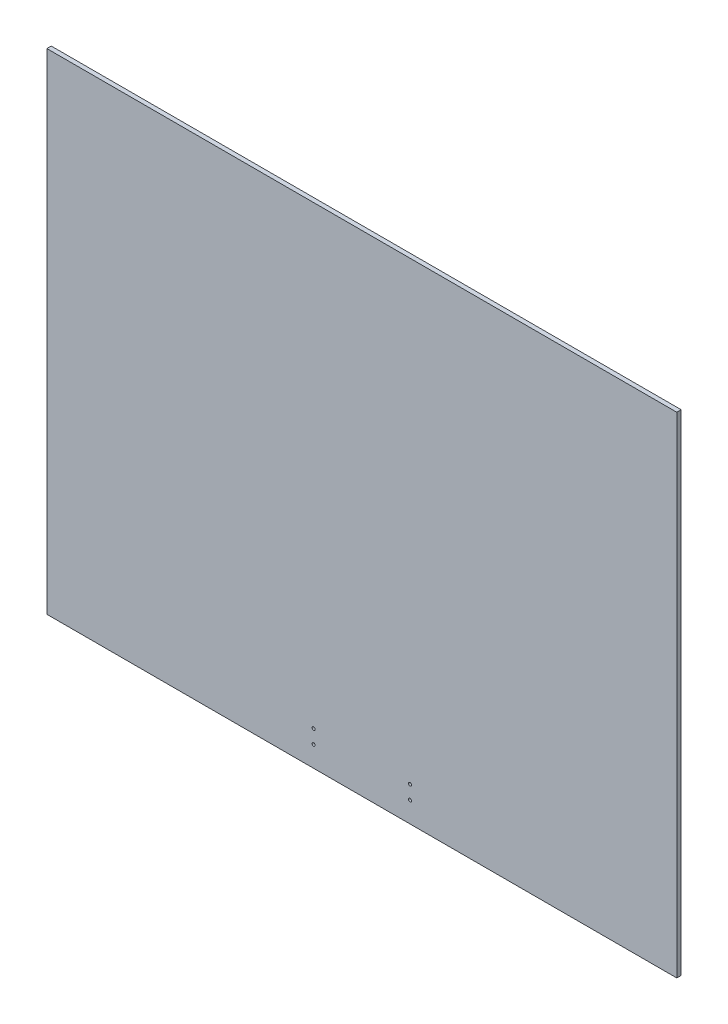
ISO-10303-21;
HEADER;
FILE_DESCRIPTION(('STEP AP214'),'2;1');
FILE_NAME('part.step','',(''),(''),'','','');
FILE_SCHEMA(('AUTOMOTIVE_DESIGN { 1 0 10303 214 1 1 1 1 }'));
ENDSEC;
DATA;
#1=APPLICATION_CONTEXT('core data for automotive mechanical design processes');
#2=APPLICATION_PROTOCOL_DEFINITION('international standard','automotive_design',2000,#1);
#3=PRODUCT_CONTEXT('',#1,'mechanical');
#4=PRODUCT('Part','Part','',(#3));
#5=PRODUCT_RELATED_PRODUCT_CATEGORY('part','',(#4));
#6=PRODUCT_DEFINITION_FORMATION('','',#4);
#7=PRODUCT_DEFINITION_CONTEXT('part definition',#1,'design');
#8=PRODUCT_DEFINITION('design','',#6,#7);
#9=PRODUCT_DEFINITION_SHAPE('','',#8);
#10=(LENGTH_UNIT() NAMED_UNIT(*) SI_UNIT(.MILLI.,.METRE.));
#11=(NAMED_UNIT(*) PLANE_ANGLE_UNIT() SI_UNIT($,.RADIAN.));
#12=(NAMED_UNIT(*) SI_UNIT($,.STERADIAN.) SOLID_ANGLE_UNIT());
#13=UNCERTAINTY_MEASURE_WITH_UNIT(LENGTH_MEASURE(1.E-05),#10,'distance_accuracy_value','');
#14=(GEOMETRIC_REPRESENTATION_CONTEXT(3) GLOBAL_UNCERTAINTY_ASSIGNED_CONTEXT((#13)) GLOBAL_UNIT_ASSIGNED_CONTEXT((#10,
#11,#12)) REPRESENTATION_CONTEXT('',''));
#15=CARTESIAN_POINT('',(0.,0.,0.));
#16=DIRECTION('',(0.,0.,1.));
#17=DIRECTION('',(1.,0.,0.));
#18=AXIS2_PLACEMENT_3D('',#15,#16,#17);
#19=CARTESIAN_POINT('',(457.2,-355.6,6.35));
#20=DIRECTION('',(-1.,0.,0.));
#21=DIRECTION('',(0.,0.,1.));
#22=AXIS2_PLACEMENT_3D('',#19,#20,#21);
#23=PLANE('',#22);
#24=DIRECTION('',(0.,1.,0.));
#25=VECTOR('',#24,1.);
#26=CARTESIAN_POINT('',(457.2,-355.6,0.));
#27=LINE('',#26,#25);
#28=CARTESIAN_POINT('',(457.2,-355.6,0.));
#29=VERTEX_POINT('',#28);
#30=CARTESIAN_POINT('',(457.2,355.6,0.));
#31=VERTEX_POINT('',#30);
#32=EDGE_CURVE('E117',#29,#31,#27,.T.);
#33=ORIENTED_EDGE('',*,*,#32,.T.);
#34=DIRECTION('',(0.,0.,-1.));
#35=VECTOR('',#34,1.);
#36=CARTESIAN_POINT('',(457.2,355.6,6.35));
#37=LINE('',#36,#35);
#38=CARTESIAN_POINT('',(457.2,355.6,6.35));
#39=VERTEX_POINT('',#38);
#40=EDGE_CURVE('E11',#39,#31,#37,.T.);
#41=ORIENTED_EDGE('',*,*,#40,.F.);
#42=DIRECTION('',(0.,1.,0.));
#43=VECTOR('',#42,1.);
#44=CARTESIAN_POINT('',(457.2,-355.6,6.35));
#45=LINE('',#44,#43);
#46=CARTESIAN_POINT('',(457.2,-355.6,6.35));
#47=VERTEX_POINT('',#46);
#48=EDGE_CURVE('E100',#47,#39,#45,.T.);
#49=ORIENTED_EDGE('',*,*,#48,.F.);
#50=DIRECTION('',(0.,0.,-1.));
#51=VECTOR('',#50,1.);
#52=CARTESIAN_POINT('',(457.2,-355.6,6.35));
#53=LINE('',#52,#51);
#54=EDGE_CURVE('E113',#47,#29,#53,.T.);
#55=ORIENTED_EDGE('',*,*,#54,.T.);
#56=EDGE_LOOP('',(#33,#41,#49,#55));
#57=FACE_BOUND('',#56,.T.);
#58=ADVANCED_FACE('F48',(#57),#23,.F.);
#59=CARTESIAN_POINT('',(-457.2,355.6,6.35));
#60=DIRECTION('',(0.,-1.,0.));
#61=DIRECTION('',(0.,0.,-1.));
#62=AXIS2_PLACEMENT_3D('',#59,#60,#61);
#63=PLANE('',#62);
#64=DIRECTION('',(-1.,0.,0.));
#65=VECTOR('',#64,1.);
#66=CARTESIAN_POINT('',(-457.2,355.6,0.));
#67=LINE('',#66,#65);
#68=CARTESIAN_POINT('',(-457.2,355.6,0.));
#69=VERTEX_POINT('',#68);
#70=EDGE_CURVE('E105',#31,#69,#67,.T.);
#71=ORIENTED_EDGE('',*,*,#70,.T.);
#72=DIRECTION('',(0.,0.,-1.));
#73=VECTOR('',#72,1.);
#74=CARTESIAN_POINT('',(-457.2,355.6,6.35));
#75=LINE('',#74,#73);
#76=CARTESIAN_POINT('',(-457.2,355.6,6.35));
#77=VERTEX_POINT('',#76);
#78=EDGE_CURVE('E57',#77,#69,#75,.T.);
#79=ORIENTED_EDGE('',*,*,#78,.F.);
#80=DIRECTION('',(-1.,0.,0.));
#81=VECTOR('',#80,1.);
#82=CARTESIAN_POINT('',(-457.2,355.6,6.35));
#83=LINE('',#82,#81);
#84=EDGE_CURVE('E95',#39,#77,#83,.T.);
#85=ORIENTED_EDGE('',*,*,#84,.F.);
#86=ORIENTED_EDGE('',*,*,#40,.T.);
#87=EDGE_LOOP('',(#71,#79,#85,#86));
#88=FACE_BOUND('',#87,.T.);
#89=ADVANCED_FACE('F104',(#88),#63,.F.);
#90=CARTESIAN_POINT('',(-457.2,-355.6,6.35));
#91=DIRECTION('',(1.,0.,0.));
#92=DIRECTION('',(0.,0.,-1.));
#93=AXIS2_PLACEMENT_3D('',#90,#91,#92);
#94=PLANE('',#93);
#95=DIRECTION('',(0.,-1.,0.));
#96=VECTOR('',#95,1.);
#97=CARTESIAN_POINT('',(-457.2,-355.6,0.));
#98=LINE('',#97,#96);
#99=CARTESIAN_POINT('',(-457.2,-355.6,0.));
#100=VERTEX_POINT('',#99);
#101=EDGE_CURVE('E82',#69,#100,#98,.T.);
#102=ORIENTED_EDGE('',*,*,#101,.T.);
#103=DIRECTION('',(0.,0.,-1.));
#104=VECTOR('',#103,1.);
#105=CARTESIAN_POINT('',(-457.2,-355.6,6.35));
#106=LINE('',#105,#104);
#107=CARTESIAN_POINT('',(-457.2,-355.6,6.35));
#108=VERTEX_POINT('',#107);
#109=EDGE_CURVE('E107',#108,#100,#106,.T.);
#110=ORIENTED_EDGE('',*,*,#109,.F.);
#111=DIRECTION('',(0.,-1.,0.));
#112=VECTOR('',#111,1.);
#113=CARTESIAN_POINT('',(-457.2,-355.6,6.35));
#114=LINE('',#113,#112);
#115=EDGE_CURVE('E98',#77,#108,#114,.T.);
#116=ORIENTED_EDGE('',*,*,#115,.F.);
#117=ORIENTED_EDGE('',*,*,#78,.T.);
#118=EDGE_LOOP('',(#102,#110,#116,#117));
#119=FACE_BOUND('',#118,.T.);
#120=ADVANCED_FACE('F108',(#119),#94,.F.);
#121=CARTESIAN_POINT('',(-457.2,-355.6,6.35));
#122=DIRECTION('',(0.,1.,0.));
#123=DIRECTION('',(0.,0.,1.));
#124=AXIS2_PLACEMENT_3D('',#121,#122,#123);
#125=PLANE('',#124);
#126=DIRECTION('',(1.,0.,0.));
#127=VECTOR('',#126,1.);
#128=CARTESIAN_POINT('',(-457.2,-355.6,0.));
#129=LINE('',#128,#127);
#130=EDGE_CURVE('E88',#100,#29,#129,.T.);
#131=ORIENTED_EDGE('',*,*,#130,.T.);
#132=ORIENTED_EDGE('',*,*,#54,.F.);
#133=DIRECTION('',(1.,0.,0.));
#134=VECTOR('',#133,1.);
#135=CARTESIAN_POINT('',(-457.2,-355.6,6.35));
#136=LINE('',#135,#134);
#137=EDGE_CURVE('E65',#108,#47,#136,.T.);
#138=ORIENTED_EDGE('',*,*,#137,.F.);
#139=ORIENTED_EDGE('',*,*,#109,.T.);
#140=EDGE_LOOP('',(#131,#132,#138,#139));
#141=FACE_BOUND('',#140,.T.);
#142=ADVANCED_FACE('F132',(#141),#125,.F.);
#143=CARTESIAN_POINT('',(0.,0.,6.35));
#144=DIRECTION('',(0.,0.,-1.));
#145=DIRECTION('',(-1.,0.,0.));
#146=AXIS2_PLACEMENT_3D('',#143,#144,#145);
#147=PLANE('',#146);
#148=CARTESIAN_POINT('',(70.,-325.6,6.35));
#149=DIRECTION('',(0.,0.,1.));
#150=DIRECTION('',(1.,0.,0.));
#151=AXIS2_PLACEMENT_3D('',#148,#149,#150);
#152=CIRCLE('',#151,2.20000000000001);
#153=CARTESIAN_POINT('',(72.2,-325.6,6.35));
#154=VERTEX_POINT('',#153);
#155=EDGE_CURVE('E157',#154,#154,#152,.T.);
#156=ORIENTED_EDGE('',*,*,#155,.F.);
#157=EDGE_LOOP('',(#156));
#158=FACE_BOUND('',#157,.T.);
#159=CARTESIAN_POINT('',(-70.,-305.6,6.35));
#160=DIRECTION('',(0.,0.,1.));
#161=DIRECTION('',(1.,0.,0.));
#162=AXIS2_PLACEMENT_3D('',#159,#160,#161);
#163=CIRCLE('',#162,2.19999999999999);
#164=CARTESIAN_POINT('',(-67.8000000000001,-305.6,6.35));
#165=VERTEX_POINT('',#164);
#166=EDGE_CURVE('E148',#165,#165,#163,.T.);
#167=ORIENTED_EDGE('',*,*,#166,.F.);
#168=EDGE_LOOP('',(#167));
#169=FACE_BOUND('',#168,.T.);
#170=CARTESIAN_POINT('',(-70.,-325.6,6.35));
#171=DIRECTION('',(0.,0.,1.));
#172=DIRECTION('',(1.,0.,0.));
#173=AXIS2_PLACEMENT_3D('',#170,#171,#172);
#174=CIRCLE('',#173,2.20000000000001);
#175=CARTESIAN_POINT('',(-67.8,-325.6,6.35));
#176=VERTEX_POINT('',#175);
#177=EDGE_CURVE('E164',#176,#176,#174,.T.);
#178=ORIENTED_EDGE('',*,*,#177,.F.);
#179=EDGE_LOOP('',(#178));
#180=FACE_BOUND('',#179,.T.);
#181=CARTESIAN_POINT('',(69.9999999999998,-305.6,6.35));
#182=DIRECTION('',(0.,0.,1.));
#183=DIRECTION('',(1.,0.,0.));
#184=AXIS2_PLACEMENT_3D('',#181,#182,#183);
#185=CIRCLE('',#184,2.19999999999999);
#186=CARTESIAN_POINT('',(72.1999999999998,-305.6,6.35));
#187=VERTEX_POINT('',#186);
#188=EDGE_CURVE('E140',#187,#187,#185,.T.);
#189=ORIENTED_EDGE('',*,*,#188,.F.);
#190=EDGE_LOOP('',(#189));
#191=FACE_BOUND('',#190,.T.);
#192=ORIENTED_EDGE('',*,*,#48,.T.);
#193=ORIENTED_EDGE('',*,*,#84,.T.);
#194=ORIENTED_EDGE('',*,*,#115,.T.);
#195=ORIENTED_EDGE('',*,*,#137,.T.);
#196=EDGE_LOOP('',(#192,#193,#194,#195));
#197=FACE_BOUND('',#196,.T.);
#198=ADVANCED_FACE('F96',(#158,#169,#180,#191,#197),#147,.F.);
#199=CARTESIAN_POINT('',(0.,0.,0.));
#200=DIRECTION('',(0.,0.,-1.));
#201=DIRECTION('',(-1.,0.,0.));
#202=AXIS2_PLACEMENT_3D('',#199,#200,#201);
#203=PLANE('',#202);
#204=CARTESIAN_POINT('',(70.,-325.6,0.));
#205=DIRECTION('',(0.,0.,1.));
#206=DIRECTION('',(1.,0.,0.));
#207=AXIS2_PLACEMENT_3D('',#204,#205,#206);
#208=CIRCLE('',#207,2.20000000000001);
#209=CARTESIAN_POINT('',(72.2,-325.6,0.));
#210=VERTEX_POINT('',#209);
#211=EDGE_CURVE('E144',#210,#210,#208,.T.);
#212=ORIENTED_EDGE('',*,*,#211,.T.);
#213=EDGE_LOOP('',(#212));
#214=FACE_BOUND('',#213,.T.);
#215=CARTESIAN_POINT('',(-70.,-305.6,0.));
#216=DIRECTION('',(0.,0.,1.));
#217=DIRECTION('',(1.,0.,0.));
#218=AXIS2_PLACEMENT_3D('',#215,#216,#217);
#219=CIRCLE('',#218,2.19999999999999);
#220=CARTESIAN_POINT('',(-67.8000000000001,-305.6,0.));
#221=VERTEX_POINT('',#220);
#222=EDGE_CURVE('E152',#221,#221,#219,.T.);
#223=ORIENTED_EDGE('',*,*,#222,.T.);
#224=EDGE_LOOP('',(#223));
#225=FACE_BOUND('',#224,.T.);
#226=CARTESIAN_POINT('',(-70.,-325.6,0.));
#227=DIRECTION('',(0.,0.,1.));
#228=DIRECTION('',(1.,0.,0.));
#229=AXIS2_PLACEMENT_3D('',#226,#227,#228);
#230=CIRCLE('',#229,2.20000000000001);
#231=CARTESIAN_POINT('',(-67.8,-325.6,0.));
#232=VERTEX_POINT('',#231);
#233=EDGE_CURVE('E153',#232,#232,#230,.T.);
#234=ORIENTED_EDGE('',*,*,#233,.T.);
#235=EDGE_LOOP('',(#234));
#236=FACE_BOUND('',#235,.T.);
#237=CARTESIAN_POINT('',(69.9999999999998,-305.6,0.));
#238=DIRECTION('',(0.,0.,1.));
#239=DIRECTION('',(1.,0.,0.));
#240=AXIS2_PLACEMENT_3D('',#237,#238,#239);
#241=CIRCLE('',#240,2.19999999999999);
#242=CARTESIAN_POINT('',(72.1999999999998,-305.6,0.));
#243=VERTEX_POINT('',#242);
#244=EDGE_CURVE('E121',#243,#243,#241,.T.);
#245=ORIENTED_EDGE('',*,*,#244,.T.);
#246=EDGE_LOOP('',(#245));
#247=FACE_BOUND('',#246,.T.);
#248=ORIENTED_EDGE('',*,*,#32,.F.);
#249=ORIENTED_EDGE('',*,*,#130,.F.);
#250=ORIENTED_EDGE('',*,*,#101,.F.);
#251=ORIENTED_EDGE('',*,*,#70,.F.);
#252=EDGE_LOOP('',(#248,#249,#250,#251));
#253=FACE_BOUND('',#252,.T.);
#254=ADVANCED_FACE('F135',(#214,#225,#236,#247,#253),#203,.T.);
#255=CARTESIAN_POINT('',(69.9999999999998,-305.6,0.));
#256=DIRECTION('',(0.,0.,1.));
#257=DIRECTION('',(1.,0.,0.));
#258=AXIS2_PLACEMENT_3D('',#255,#256,#257);
#259=CYLINDRICAL_SURFACE('',#258,2.19999999999999);
#260=ORIENTED_EDGE('',*,*,#244,.F.);
#261=EDGE_LOOP('',(#260));
#262=FACE_BOUND('',#261,.T.);
#263=ORIENTED_EDGE('',*,*,#188,.T.);
#264=EDGE_LOOP('',(#263));
#265=FACE_BOUND('',#264,.T.);
#266=ADVANCED_FACE('F179',(#262,#265),#259,.F.);
#267=CARTESIAN_POINT('',(-70.,-325.6,0.));
#268=DIRECTION('',(0.,0.,1.));
#269=DIRECTION('',(1.,0.,0.));
#270=AXIS2_PLACEMENT_3D('',#267,#268,#269);
#271=CYLINDRICAL_SURFACE('',#270,2.20000000000001);
#272=ORIENTED_EDGE('',*,*,#233,.F.);
#273=EDGE_LOOP('',(#272));
#274=FACE_BOUND('',#273,.T.);
#275=ORIENTED_EDGE('',*,*,#177,.T.);
#276=EDGE_LOOP('',(#275));
#277=FACE_BOUND('',#276,.T.);
#278=ADVANCED_FACE('F175',(#274,#277),#271,.F.);
#279=CARTESIAN_POINT('',(-70.,-305.6,0.));
#280=DIRECTION('',(0.,0.,1.));
#281=DIRECTION('',(1.,0.,0.));
#282=AXIS2_PLACEMENT_3D('',#279,#280,#281);
#283=CYLINDRICAL_SURFACE('',#282,2.19999999999999);
#284=ORIENTED_EDGE('',*,*,#222,.F.);
#285=EDGE_LOOP('',(#284));
#286=FACE_BOUND('',#285,.T.);
#287=ORIENTED_EDGE('',*,*,#166,.T.);
#288=EDGE_LOOP('',(#287));
#289=FACE_BOUND('',#288,.T.);
#290=ADVANCED_FACE('F178',(#286,#289),#283,.F.);
#291=CARTESIAN_POINT('',(70.,-325.6,0.));
#292=DIRECTION('',(0.,0.,1.));
#293=DIRECTION('',(1.,0.,0.));
#294=AXIS2_PLACEMENT_3D('',#291,#292,#293);
#295=CYLINDRICAL_SURFACE('',#294,2.20000000000001);
#296=ORIENTED_EDGE('',*,*,#211,.F.);
#297=EDGE_LOOP('',(#296));
#298=FACE_BOUND('',#297,.T.);
#299=ORIENTED_EDGE('',*,*,#155,.T.);
#300=EDGE_LOOP('',(#299));
#301=FACE_BOUND('',#300,.T.);
#302=ADVANCED_FACE('F243',(#298,#301),#295,.F.);
#303=CLOSED_SHELL('',(#58,#89,#120,#142,#198,#254,#266,#278,#290,#302));
#304=MANIFOLD_SOLID_BREP('B2',#303);
#305=ADVANCED_BREP_SHAPE_REPRESENTATION('',(#18,#304),#14);
#306=SHAPE_DEFINITION_REPRESENTATION(#9,#305);
ENDSEC;
END-ISO-10303-21;
